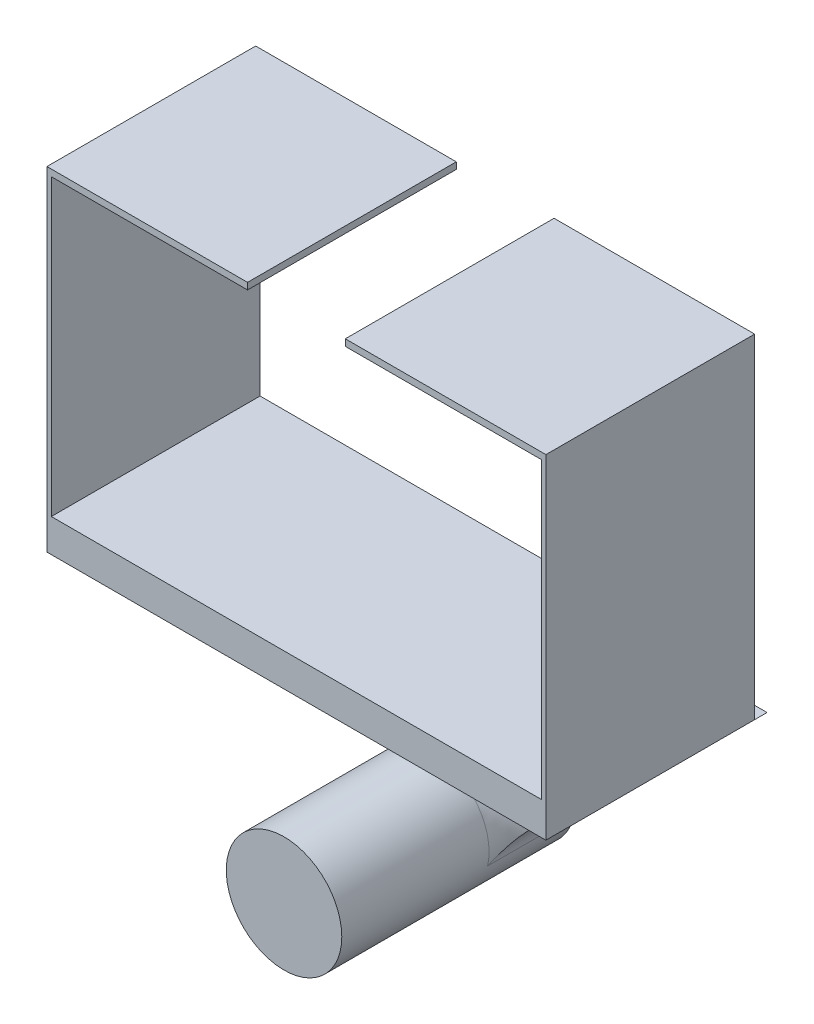
ISO-10303-21;
HEADER;
FILE_DESCRIPTION(('STEP AP214'),'2;1');
FILE_NAME('part.step','',(''),(''),'','','');
FILE_SCHEMA(('AUTOMOTIVE_DESIGN { 1 0 10303 214 1 1 1 1 }'));
ENDSEC;
DATA;
#1=APPLICATION_CONTEXT('core data for automotive mechanical design processes');
#2=APPLICATION_PROTOCOL_DEFINITION('international standard','automotive_design',2000,#1);
#3=PRODUCT_CONTEXT('',#1,'mechanical');
#4=PRODUCT('Part','Part','',(#3));
#5=PRODUCT_RELATED_PRODUCT_CATEGORY('part','',(#4));
#6=PRODUCT_DEFINITION_FORMATION('','',#4);
#7=PRODUCT_DEFINITION_CONTEXT('part definition',#1,'design');
#8=PRODUCT_DEFINITION('design','',#6,#7);
#9=PRODUCT_DEFINITION_SHAPE('','',#8);
#10=(LENGTH_UNIT() NAMED_UNIT(*) SI_UNIT(.MILLI.,.METRE.));
#11=(NAMED_UNIT(*) PLANE_ANGLE_UNIT() SI_UNIT($,.RADIAN.));
#12=(NAMED_UNIT(*) SI_UNIT($,.STERADIAN.) SOLID_ANGLE_UNIT());
#13=UNCERTAINTY_MEASURE_WITH_UNIT(LENGTH_MEASURE(1.E-05),#10,'distance_accuracy_value','');
#14=(GEOMETRIC_REPRESENTATION_CONTEXT(3) GLOBAL_UNCERTAINTY_ASSIGNED_CONTEXT((#13)) GLOBAL_UNIT_ASSIGNED_CONTEXT((#10,
#11,#12)) REPRESENTATION_CONTEXT('',''));
#15=CARTESIAN_POINT('',(0.,0.,0.));
#16=DIRECTION('',(0.,0.,1.));
#17=DIRECTION('',(1.,0.,0.));
#18=AXIS2_PLACEMENT_3D('',#15,#16,#17);
#19=CARTESIAN_POINT('',(0.,0.,-19.05));
#20=DIRECTION('',(0.,0.,-1.));
#21=DIRECTION('',(-1.,0.,0.));
#22=AXIS2_PLACEMENT_3D('',#19,#20,#21);
#23=TOROIDAL_SURFACE('',#22,13.8227494521249,6.35);
#24=CARTESIAN_POINT('',(9.20129048099303,1.56250833045129,-23.5405221598038));
#25=CARTESIAN_POINT('',(9.12447143228191,1.49305911225083,-23.4531719699937));
#26=CARTESIAN_POINT('',(9.05054991816206,1.42283327463212,-23.3639544715265));
#27=CARTESIAN_POINT('',(8.90822884561001,1.28114921356395,-23.1822346767722));
#28=CARTESIAN_POINT('',(8.83982696721798,1.20969152336378,-23.0897337843175));
#29=CARTESIAN_POINT('',(8.64267068130203,0.994160488198916,-22.8082561890728));
#30=CARTESIAN_POINT('',(8.5216500132169,0.848639110754902,-22.6149393392792));
#31=CARTESIAN_POINT('',(8.29879272158506,0.556354352007747,-22.2210033267864));
#32=CARTESIAN_POINT('',(8.19683414347178,0.409605617025795,-22.0204411232039));
#33=CARTESIAN_POINT('',(8.00901026563295,0.11458913340125,-21.6129257446468));
#34=CARTESIAN_POINT('',(7.92315049662919,-0.0336791188869155,-21.4059704016554));
#35=CARTESIAN_POINT('',(7.77940526535196,-0.305848442452853,-21.0235468802228));
#36=CARTESIAN_POINT('',(7.71924820723049,-0.429555849135334,-20.8487831684695));
#37=CARTESIAN_POINT('',(7.60805290356127,-0.677960128349764,-20.4969688543684));
#38=CARTESIAN_POINT('',(7.55701822807717,-0.802657368403367,-20.3199173856409));
#39=CARTESIAN_POINT('',(7.46320798115231,-1.05402686520723,-19.963210925047));
#40=CARTESIAN_POINT('',(7.42048917275977,-1.18070672635545,-19.7835464614004));
#41=CARTESIAN_POINT('',(7.34334027089114,-1.43552917861257,-19.4235315170715));
#42=CARTESIAN_POINT('',(7.30890823975931,-1.563671420426,-19.2431812067955));
#43=CARTESIAN_POINT('',(7.27779566223699,-1.69580344329123,-19.0585600924886));
#44=CARTESIAN_POINT('',(7.27707665782426,-1.69886717133372,-19.0542800411443));
#45=CARTESIAN_POINT('',(7.27635992810099,-1.70193142369473,-19.05));
#46=B_SPLINE_CURVE_WITH_KNOTS('',3,(#24,#25,#26,#27,#28,#29,#30,#31,#32,#33,#34,#35,#36,#37,#38,
#39,#40,#41,#42,#43,#44,#45),.UNSPECIFIED.,.F.,.F.,(4,2,2,2,2,2,2,2,2,2,4),(0.,
0.406322901873472,0.812474122719447,1.62309363120789,2.42833485674762,3.23385221685592,
3.90086742583033,4.56814310380479,5.23982503406811,5.91134975537807,5.92728713437383),.UNSPECIFIED.);
#47=CARTESIAN_POINT('',(9.20129048099302,1.56250833045129,-23.5405221598038));
#48=VERTEX_POINT('',#47);
#49=CARTESIAN_POINT('',(7.27635992810104,-1.70193142369486,-19.05));
#50=VERTEX_POINT('',#49);
#51=EDGE_CURVE('E12',#48,#50,#46,.T.);
#52=ORIENTED_EDGE('',*,*,#51,.F.);
#53=CARTESIAN_POINT('',(9.20129048099302,1.56250833045129,-23.5405221598038));
#54=CARTESIAN_POINT('',(9.3297867547812,1.67866206638977,-23.6865969379361));
#55=CARTESIAN_POINT('',(9.46295654800344,1.79904041309902,-23.8251740855197));
#56=CARTESIAN_POINT('',(9.73755444640503,2.04726217735639,-24.0865306476336));
#57=CARTESIAN_POINT('',(9.87898179766771,2.17510491340431,-24.2093115011));
#58=CARTESIAN_POINT('',(10.1648473935915,2.43351207155714,-24.4349978961655));
#59=CARTESIAN_POINT('',(10.3090811711777,2.56389166639872,-24.5383745208502));
#60=CARTESIAN_POINT('',(10.6033963628109,2.82993680563752,-24.7287278227252));
#61=CARTESIAN_POINT('',(10.7534780009589,2.9656025526101,-24.815703870667));
#62=CARTESIAN_POINT('',(11.0637392947505,3.24606211247563,-24.9751547000895));
#63=CARTESIAN_POINT('',(11.2240887503921,3.39100941545484,-25.0470305671752));
#64=CARTESIAN_POINT('',(11.5488380195187,3.68456532754717,-25.1715460652564));
#65=CARTESIAN_POINT('',(11.7132375429171,3.83317367443745,-25.2241870697007));
#66=CARTESIAN_POINT('',(12.0499611829547,4.13755377524608,-25.3107538897783));
#67=CARTESIAN_POINT('',(12.222373871997,4.2934055938636,-25.3440579042153));
#68=CARTESIAN_POINT('',(12.5688467131087,4.6065984492664,-25.3887018406444));
#69=CARTESIAN_POINT('',(12.7429077182123,4.76394025714885,-25.4000296861277));
#70=CARTESIAN_POINT('',(12.9170062761552,4.92131601078283,-25.4));
#71=B_SPLINE_CURVE_WITH_KNOTS('',3,(#53,#54,#55,#56,#57,#58,#59,#60,#61,#62,#63,#64,#65,#66,#67,
#68,#69,#70),.UNSPECIFIED.,.F.,.F.,(4,2,2,2,2,2,2,2,4),(0.,0.679521621999242,1.35898130026054,
2.01884528035295,2.67873457260078,3.36123209380029,4.04368087232189,4.74700715432743,
5.45071982409082),.UNSPECIFIED.);
#72=CARTESIAN_POINT('',(12.9170062761552,4.92131601078283,-25.4));
#73=VERTEX_POINT('',#72);
#74=EDGE_CURVE('E231',#73,#48,#71,.F.);
#75=ORIENTED_EDGE('',*,*,#74,.F.);
#76=CARTESIAN_POINT('',(0.,0.,-25.4));
#77=DIRECTION('',(0.,0.,-1.));
#78=DIRECTION('',(-1.,0.,0.));
#79=AXIS2_PLACEMENT_3D('',#76,#77,#78);
#80=CIRCLE('',#79,13.8227494521249);
#81=CARTESIAN_POINT('',(-12.9170062761552,4.92131601078283,-25.4));
#82=VERTEX_POINT('',#81);
#83=EDGE_CURVE('E239',#82,#73,#80,.T.);
#84=ORIENTED_EDGE('',*,*,#83,.F.);
#85=CARTESIAN_POINT('',(-9.20129048099302,1.56250833045129,-23.5405221598038));
#86=CARTESIAN_POINT('',(-9.3297867547812,1.67866206638977,-23.6865969379361));
#87=CARTESIAN_POINT('',(-9.46295654800344,1.79904041309902,-23.8251740855197));
#88=CARTESIAN_POINT('',(-9.73755444640503,2.04726217735639,-24.0865306476336));
#89=CARTESIAN_POINT('',(-9.8789817976677,2.17510491340431,-24.2093115011));
#90=CARTESIAN_POINT('',(-10.1648473935915,2.43351207155714,-24.4349978961655));
#91=CARTESIAN_POINT('',(-10.3090811711777,2.56389166639872,-24.5383745208502));
#92=CARTESIAN_POINT('',(-10.6033963628109,2.82993680563752,-24.7287278227252));
#93=CARTESIAN_POINT('',(-10.7534780009589,2.9656025526101,-24.815703870667));
#94=CARTESIAN_POINT('',(-11.0637392947505,3.24606211247563,-24.9751547000895));
#95=CARTESIAN_POINT('',(-11.2240887503921,3.39100941545484,-25.0470305671752));
#96=CARTESIAN_POINT('',(-11.5488380195187,3.68456532754717,-25.1715460652564));
#97=CARTESIAN_POINT('',(-11.7132375429171,3.83317367443745,-25.2241870697007));
#98=CARTESIAN_POINT('',(-12.0499611829547,4.13755377524608,-25.3107538897783));
#99=CARTESIAN_POINT('',(-12.222373871997,4.2934055938636,-25.3440579042153));
#100=CARTESIAN_POINT('',(-12.5688467131087,4.6065984492664,-25.3887018406444));
#101=CARTESIAN_POINT('',(-12.7429077182123,4.76394025714885,-25.4000296861277));
#102=CARTESIAN_POINT('',(-12.9170062761552,4.92131601078283,-25.4));
#103=B_SPLINE_CURVE_WITH_KNOTS('',3,(#85,#86,#87,#88,#89,#90,#91,#92,#93,#94,#95,#96,#97,#98,
#99,#100,#101,#102),.UNSPECIFIED.,.F.,.F.,(4,2,2,2,2,2,2,2,4),(0.,0.679521621999242,
1.35898130026054,2.01884528035295,2.67873457260078,3.3612320938003,4.04368087232189,
4.74700715432743,5.45071982409082),.UNSPECIFIED.);
#104=CARTESIAN_POINT('',(-9.201290480993,1.56250833045126,-23.5405221598039));
#105=VERTEX_POINT('',#104);
#106=EDGE_CURVE('E240',#105,#82,#103,.T.);
#107=ORIENTED_EDGE('',*,*,#106,.F.);
#108=CARTESIAN_POINT('',(-9.20129048099303,1.56250833045129,-23.5405221598038));
#109=CARTESIAN_POINT('',(-9.12447143228196,1.49305911225087,-23.4531719699938));
#110=CARTESIAN_POINT('',(-9.05054991816213,1.42283327463219,-23.3639544715266));
#111=CARTESIAN_POINT('',(-8.90822884561015,1.28114921356409,-23.1822346767724));
#112=CARTESIAN_POINT('',(-8.83982696721815,1.20969152336396,-23.0897337843178));
#113=CARTESIAN_POINT('',(-8.64267068130228,0.994160488199216,-22.8082561890732));
#114=CARTESIAN_POINT('',(-8.52165001321721,0.848639110755284,-22.6149393392797));
#115=CARTESIAN_POINT('',(-8.29879272158533,0.556354352008129,-22.2210033267869));
#116=CARTESIAN_POINT('',(-8.19683414347199,0.409605617026094,-22.0204411232044));
#117=CARTESIAN_POINT('',(-8.00901026563305,0.114589133401417,-21.612925744647));
#118=CARTESIAN_POINT('',(-7.92315049662924,-0.0336791188867981,-21.4059704016555));
#119=CARTESIAN_POINT('',(-7.77940526535195,-0.305848442452894,-21.0235468802228));
#120=CARTESIAN_POINT('',(-7.71924820723046,-0.42955584913546,-20.8487831684696));
#121=CARTESIAN_POINT('',(-7.60805290356129,-0.677960128349668,-20.4969688543683));
#122=CARTESIAN_POINT('',(-7.55701822807726,-0.802657368402962,-20.3199173856406));
#123=CARTESIAN_POINT('',(-7.46320798115222,-1.05402686520765,-19.9632109250473));
#124=CARTESIAN_POINT('',(-7.42048917275941,-1.180706726357,-19.7835464614015));
#125=CARTESIAN_POINT('',(-7.3433402708915,-1.435529178611,-19.4235315170703));
#126=CARTESIAN_POINT('',(-7.30890823976066,-1.56367142042017,-19.2431812067911));
#127=CARTESIAN_POINT('',(-7.27779566223706,-1.69580344329096,-19.0585600924884));
#128=CARTESIAN_POINT('',(-7.27707665782429,-1.69886717133358,-19.0542800411442));
#129=CARTESIAN_POINT('',(-7.27635992810099,-1.70193142369473,-19.05));
#130=B_SPLINE_CURVE_WITH_KNOTS('',3,(#108,#109,#110,#111,#112,#113,#114,#115,#116,#117,#118,
#119,#120,#121,#122,#123,#124,#125,#126,#127,#128,#129),.UNSPECIFIED.,.F.,.F.,(4,2,2,2,2,2,2,2,
2,2,4),(0.,0.406322901873264,0.812474122719031,1.62309363120705,2.42833485674719,
3.23385221685592,3.90086742583037,4.56814310380479,5.2398250340681,5.91134975537807,
5.92728713437383),.UNSPECIFIED.);
#131=CARTESIAN_POINT('',(-7.27635992810104,-1.70193142369486,-19.05));
#132=VERTEX_POINT('',#131);
#133=EDGE_CURVE('E82',#105,#132,#130,.T.);
#134=ORIENTED_EDGE('',*,*,#133,.T.);
#135=CARTESIAN_POINT('',(0.,0.,-19.05));
#136=DIRECTION('',(0.,0.,-1.));
#137=DIRECTION('',(-1.,0.,0.));
#138=AXIS2_PLACEMENT_3D('',#135,#136,#137);
#139=CIRCLE('',#138,7.47274945212493);
#140=EDGE_CURVE('E474',#50,#132,#139,.F.);
#141=ORIENTED_EDGE('',*,*,#140,.F.);
#142=EDGE_LOOP('',(#52,#75,#84,#107,#134,#141));
#143=FACE_BOUND('',#142,.T.);
#144=ADVANCED_FACE('F69',(#143),#23,.F.);
#145=CARTESIAN_POINT('',(-13.4594771113357,-3.14815474614112,-25.4));
#146=DIRECTION('',(0.,0.,1.));
#147=DIRECTION('',(1.,0.,0.));
#148=AXIS2_PLACEMENT_3D('',#145,#146,#147);
#149=CYLINDRICAL_SURFACE('',#148,6.35);
#150=ORIENTED_EDGE('',*,*,#133,.F.);
#151=DIRECTION('',(0.,0.,-1.));
#152=VECTOR('',#151,1.);
#153=CARTESIAN_POINT('',(-9.20129048099299,1.56250833045127,-25.4));
#154=LINE('',#153,#152);
#155=CARTESIAN_POINT('',(-9.201290480993,1.56250833045127,-30.2126316201082));
#156=VERTEX_POINT('',#155);
#157=EDGE_CURVE('E470',#156,#105,#154,.F.);
#158=ORIENTED_EDGE('',*,*,#157,.F.);
#159=CARTESIAN_POINT('',(-13.4594771113357,-3.14815474614112,-30.2126316201082));
#160=DIRECTION('',(0.,0.,1.));
#161=DIRECTION('',(-1.,0.,0.));
#162=AXIS2_PLACEMENT_3D('',#159,#160,#161);
#163=CIRCLE('',#162,6.35);
#164=CARTESIAN_POINT('',(-7.27635992810065,-1.70193142369615,-30.2126316201082));
#165=VERTEX_POINT('',#164);
#166=EDGE_CURVE('E263',#165,#156,#163,.T.);
#167=ORIENTED_EDGE('',*,*,#166,.F.);
#168=DIRECTION('',(0.,0.,1.));
#169=VECTOR('',#168,1.);
#170=CARTESIAN_POINT('',(-7.27635992810099,-1.70193142369473,-25.4));
#171=LINE('',#170,#169);
#172=EDGE_CURVE('E480',#132,#165,#171,.F.);
#173=ORIENTED_EDGE('',*,*,#172,.F.);
#174=EDGE_LOOP('',(#150,#158,#167,#173));
#175=FACE_BOUND('',#174,.T.);
#176=ADVANCED_FACE('F580',(#175),#149,.F.);
#177=CARTESIAN_POINT('',(13.4594771113357,-3.14815474614112,-25.4));
#178=DIRECTION('',(0.,0.,1.));
#179=DIRECTION('',(1.,0.,0.));
#180=AXIS2_PLACEMENT_3D('',#177,#178,#179);
#181=CYLINDRICAL_SURFACE('',#180,6.35);
#182=DIRECTION('',(0.,0.,1.));
#183=VECTOR('',#182,1.);
#184=CARTESIAN_POINT('',(9.20129048099299,1.56250833045127,-25.4));
#185=LINE('',#184,#183);
#186=CARTESIAN_POINT('',(9.201290480993,1.56250833045127,-30.2126316201082));
#187=VERTEX_POINT('',#186);
#188=EDGE_CURVE('E226',#48,#187,#185,.F.);
#189=ORIENTED_EDGE('',*,*,#188,.F.);
#190=ORIENTED_EDGE('',*,*,#51,.T.);
#191=DIRECTION('',(0.,0.,1.));
#192=VECTOR('',#191,1.);
#193=CARTESIAN_POINT('',(7.27635992810099,-1.70193142369473,-25.4));
#194=LINE('',#193,#192);
#195=CARTESIAN_POINT('',(7.27635992810097,-1.70193142369478,-30.2126316201082));
#196=VERTEX_POINT('',#195);
#197=EDGE_CURVE('E245',#196,#50,#194,.T.);
#198=ORIENTED_EDGE('',*,*,#197,.F.);
#199=CARTESIAN_POINT('',(13.4594771113357,-3.14815474614112,-30.2126316201082));
#200=DIRECTION('',(0.,0.,1.));
#201=DIRECTION('',(-1.,0.,0.));
#202=AXIS2_PLACEMENT_3D('',#199,#200,#201);
#203=CIRCLE('',#202,6.35);
#204=EDGE_CURVE('E244',#187,#196,#203,.T.);
#205=ORIENTED_EDGE('',*,*,#204,.F.);
#206=EDGE_LOOP('',(#189,#190,#198,#205));
#207=FACE_BOUND('',#206,.T.);
#208=ADVANCED_FACE('F70',(#207),#181,.F.);
#209=CARTESIAN_POINT('',(31.70428,16.0682483563748,-19.05));
#210=DIRECTION('',(1.,0.,0.));
#211=DIRECTION('',(0.,1.,0.));
#212=AXIS2_PLACEMENT_3D('',#209,#210,#211);
#213=CYLINDRICAL_SURFACE('',#212,6.35);
#214=DIRECTION('',(1.,0.,0.));
#215=VECTOR('',#214,1.);
#216=CARTESIAN_POINT('',(31.70428,22.4182483563748,-19.05));
#217=LINE('',#216,#215);
#218=CARTESIAN_POINT('',(-32.2731689597485,22.4182483563748,-19.05));
#219=VERTEX_POINT('',#218);
#220=CARTESIAN_POINT('',(32.2731689597485,22.4182483563748,-19.05));
#221=VERTEX_POINT('',#220);
#222=EDGE_CURVE('E452',#219,#221,#217,.T.);
#223=ORIENTED_EDGE('',*,*,#222,.F.);
#224=CARTESIAN_POINT('',(-25.2484156708222,16.0682483563748,-19.05));
#225=DIRECTION('',(-0.67058057170751,-0.741836704975178,0.));
#226=DIRECTION('',(0.741836704975178,-0.67058057170751,0.));
#227=AXIS2_PLACEMENT_3D('',#224,#225,#226);
#228=ELLIPSE('',#227,9.46940646346329,6.35);
#229=CARTESIAN_POINT('',(-25.2484156708222,16.0682483563748,-25.4));
#230=VERTEX_POINT('',#229);
#231=EDGE_CURVE('E458',#219,#230,#228,.T.);
#232=ORIENTED_EDGE('',*,*,#231,.T.);
#233=DIRECTION('',(1.,0.,0.));
#234=VECTOR('',#233,1.);
#235=CARTESIAN_POINT('',(0.,16.0682483563748,-25.4));
#236=LINE('',#235,#234);
#237=CARTESIAN_POINT('',(25.2484156708222,16.0682483563748,-25.4));
#238=VERTEX_POINT('',#237);
#239=EDGE_CURVE('E457',#238,#230,#236,.F.);
#240=ORIENTED_EDGE('',*,*,#239,.F.);
#241=CARTESIAN_POINT('',(25.2484156708222,16.0682483563748,-19.05));
#242=DIRECTION('',(-0.67058057170751,0.741836704975178,0.));
#243=DIRECTION('',(0.741836704975178,0.67058057170751,0.));
#244=AXIS2_PLACEMENT_3D('',#241,#242,#243);
#245=ELLIPSE('',#244,9.46940646346329,6.35);
#246=EDGE_CURVE('E461',#238,#221,#245,.F.);
#247=ORIENTED_EDGE('',*,*,#246,.T.);
#248=EDGE_LOOP('',(#223,#232,#240,#247));
#249=FACE_BOUND('',#248,.T.);
#250=ADVANCED_FACE('F522',(#249),#213,.F.);
#251=CARTESIAN_POINT('',(-31.70428,64.7626659164591,-28.6084210800721));
#252=DIRECTION('',(1.,0.,0.));
#253=DIRECTION('',(0.,0.,-1.));
#254=AXIS2_PLACEMENT_3D('',#251,#252,#253);
#255=PLANE('',#254);
#256=DIRECTION('',(0.,-1.,0.));
#257=VECTOR('',#256,1.);
#258=CARTESIAN_POINT('',(-31.70428,64.7626659164591,-28.6084210800721));
#259=LINE('',#258,#257);
#260=CARTESIAN_POINT('',(-31.70428,64.7626659164591,-28.6084210800721));
#261=VERTEX_POINT('',#260);
#262=CARTESIAN_POINT('',(-31.70428,26.6880659164591,-28.6084210800721));
#263=VERTEX_POINT('',#262);
#264=EDGE_CURVE('E361',#261,#263,#259,.T.);
#265=ORIENTED_EDGE('',*,*,#264,.F.);
#266=DIRECTION('',(0.,0.,1.));
#267=VECTOR('',#266,1.);
#268=CARTESIAN_POINT('',(-31.70428,64.7626659164591,-28.6084210800721));
#269=LINE('',#268,#267);
#270=CARTESIAN_POINT('',(-31.70428,64.7626659164591,-1.60421054003606));
#271=VERTEX_POINT('',#270);
#272=EDGE_CURVE('E313',#261,#271,#269,.T.);
#273=ORIENTED_EDGE('',*,*,#272,.T.);
#274=DIRECTION('',(0.,-1.,0.));
#275=VECTOR('',#274,1.);
#276=CARTESIAN_POINT('',(-31.70428,64.7626659164591,-1.60421054003606));
#277=LINE('',#276,#275);
#278=CARTESIAN_POINT('',(-31.70428,26.6880659164591,-1.60421054003606));
#279=VERTEX_POINT('',#278);
#280=EDGE_CURVE('E362',#271,#279,#277,.T.);
#281=ORIENTED_EDGE('',*,*,#280,.T.);
#282=DIRECTION('',(0.,0.,1.));
#283=VECTOR('',#282,1.);
#284=CARTESIAN_POINT('',(-31.70428,26.6880659164591,-28.6084210800721));
#285=LINE('',#284,#283);
#286=EDGE_CURVE('E360',#263,#279,#285,.T.);
#287=ORIENTED_EDGE('',*,*,#286,.F.);
#288=EDGE_LOOP('',(#265,#273,#281,#287));
#289=FACE_BOUND('',#288,.T.);
#290=ADVANCED_FACE('F516',(#289),#255,.T.);
#291=CARTESIAN_POINT('',(31.70428,64.7626659164591,-28.6084210800721));
#292=DIRECTION('',(1.,0.,0.));
#293=DIRECTION('',(0.,0.,-1.));
#294=AXIS2_PLACEMENT_3D('',#291,#292,#293);
#295=PLANE('',#294);
#296=DIRECTION('',(0.,0.,1.));
#297=VECTOR('',#296,1.);
#298=CARTESIAN_POINT('',(31.70428,64.7626659164591,-28.6084210800721));
#299=LINE('',#298,#297);
#300=CARTESIAN_POINT('',(31.70428,64.7626659164591,-28.6084210800721));
#301=VERTEX_POINT('',#300);
#302=CARTESIAN_POINT('',(31.70428,64.7626659164591,-1.60421054003606));
#303=VERTEX_POINT('',#302);
#304=EDGE_CURVE('E379',#301,#303,#299,.T.);
#305=ORIENTED_EDGE('',*,*,#304,.F.);
#306=DIRECTION('',(0.,-1.,0.));
#307=VECTOR('',#306,1.);
#308=CARTESIAN_POINT('',(31.70428,64.7626659164591,-28.6084210800721));
#309=LINE('',#308,#307);
#310=CARTESIAN_POINT('',(31.70428,26.6880659164591,-28.6084210800721));
#311=VERTEX_POINT('',#310);
#312=EDGE_CURVE('E419',#301,#311,#309,.T.);
#313=ORIENTED_EDGE('',*,*,#312,.T.);
#314=DIRECTION('',(0.,0.,1.));
#315=VECTOR('',#314,1.);
#316=CARTESIAN_POINT('',(31.70428,26.6880659164591,-28.6084210800721));
#317=LINE('',#316,#315);
#318=CARTESIAN_POINT('',(31.70428,26.6880659164591,-1.60421054003606));
#319=VERTEX_POINT('',#318);
#320=EDGE_CURVE('E416',#311,#319,#317,.T.);
#321=ORIENTED_EDGE('',*,*,#320,.T.);
#322=DIRECTION('',(0.,-1.,0.));
#323=VECTOR('',#322,1.);
#324=CARTESIAN_POINT('',(31.70428,64.7626659164591,-1.60421054003606));
#325=LINE('',#324,#323);
#326=EDGE_CURVE('E423',#303,#319,#325,.T.);
#327=ORIENTED_EDGE('',*,*,#326,.F.);
#328=EDGE_LOOP('',(#305,#313,#321,#327));
#329=FACE_BOUND('',#328,.T.);
#330=ADVANCED_FACE('F517',(#329),#295,.F.);
#331=CARTESIAN_POINT('',(31.70428,26.6880659164591,-1.60421054003606));
#332=DIRECTION('',(0.,-1.,0.));
#333=DIRECTION('',(0.,0.,-1.));
#334=AXIS2_PLACEMENT_3D('',#331,#332,#333);
#335=PLANE('',#334);
#336=DIRECTION('',(-1.,0.,0.));
#337=VECTOR('',#336,1.);
#338=CARTESIAN_POINT('',(31.70428,26.6880659164591,-28.6084210800721));
#339=LINE('',#338,#337);
#340=EDGE_CURVE('E440',#311,#263,#339,.T.);
#341=ORIENTED_EDGE('',*,*,#340,.T.);
#342=ORIENTED_EDGE('',*,*,#286,.T.);
#343=DIRECTION('',(-1.,0.,0.));
#344=VECTOR('',#343,1.);
#345=CARTESIAN_POINT('',(31.70428,26.6880659164591,-1.60421054003606));
#346=LINE('',#345,#344);
#347=EDGE_CURVE('E444',#319,#279,#346,.T.);
#348=ORIENTED_EDGE('',*,*,#347,.F.);
#349=ORIENTED_EDGE('',*,*,#320,.F.);
#350=EDGE_LOOP('',(#341,#342,#348,#349));
#351=FACE_BOUND('',#350,.T.);
#352=ADVANCED_FACE('F544',(#351),#335,.F.);
#353=CARTESIAN_POINT('',(0.,0.,-25.4));
#354=DIRECTION('',(0.,0.,1.));
#355=DIRECTION('',(1.,0.,0.));
#356=AXIS2_PLACEMENT_3D('',#353,#354,#355);
#357=CYLINDRICAL_SURFACE('',#356,7.47274945212493);
#358=ORIENTED_EDGE('',*,*,#140,.T.);
#359=ORIENTED_EDGE('',*,*,#172,.T.);
#360=CARTESIAN_POINT('',(0.,0.,-30.2126316201082));
#361=DIRECTION('',(0.,0.,-1.));
#362=DIRECTION('',(-1.,0.,0.));
#363=AXIS2_PLACEMENT_3D('',#360,#361,#362);
#364=CIRCLE('',#363,7.47274945212492);
#365=EDGE_CURVE('E249',#196,#165,#364,.T.);
#366=ORIENTED_EDGE('',*,*,#365,.F.);
#367=ORIENTED_EDGE('',*,*,#197,.T.);
#368=EDGE_LOOP('',(#358,#359,#366,#367));
#369=FACE_BOUND('',#368,.T.);
#370=CARTESIAN_POINT('',(0.,0.,0.));
#371=DIRECTION('',(0.,0.,1.));
#372=DIRECTION('',(1.,0.,0.));
#373=AXIS2_PLACEMENT_3D('',#370,#371,#372);
#374=CIRCLE('',#373,7.47274945212493);
#375=CARTESIAN_POINT('',(7.47274945212493,0.,0.));
#376=VERTEX_POINT('',#375);
#377=EDGE_CURVE('E442',#376,#376,#374,.T.);
#378=ORIENTED_EDGE('',*,*,#377,.F.);
#379=EDGE_LOOP('',(#378));
#380=FACE_BOUND('',#379,.T.);
#381=ADVANCED_FACE('F554',(#369,#380),#357,.T.);
#382=CARTESIAN_POINT('',(0.,0.,0.));
#383=DIRECTION('',(0.,0.,1.));
#384=DIRECTION('',(1.,0.,0.));
#385=AXIS2_PLACEMENT_3D('',#382,#383,#384);
#386=PLANE('',#385);
#387=ORIENTED_EDGE('',*,*,#377,.T.);
#388=EDGE_LOOP('',(#387));
#389=FACE_BOUND('',#388,.T.);
#390=ADVANCED_FACE('F564',(#389),#386,.T.);
#391=CARTESIAN_POINT('',(0.,0.,-25.4));
#392=DIRECTION('',(0.,0.,-1.));
#393=DIRECTION('',(-1.,0.,0.));
#394=AXIS2_PLACEMENT_3D('',#391,#392,#393);
#395=PLANE('',#394);
#396=DIRECTION('',(-0.741836704975178,0.67058057170751,0.));
#397=VECTOR('',#396,1.);
#398=CARTESIAN_POINT('',(-3.36033329350836,-3.71740352054509,-25.4));
#399=LINE('',#398,#397);
#400=EDGE_CURVE('E310',#82,#230,#399,.T.);
#401=ORIENTED_EDGE('',*,*,#400,.F.);
#402=ORIENTED_EDGE('',*,*,#83,.T.);
#403=DIRECTION('',(0.741836704975178,0.67058057170751,0.));
#404=VECTOR('',#403,1.);
#405=CARTESIAN_POINT('',(3.36033329350836,-3.71740352054509,-25.4));
#406=LINE('',#405,#404);
#407=EDGE_CURVE('E306',#73,#238,#406,.T.);
#408=ORIENTED_EDGE('',*,*,#407,.T.);
#409=ORIENTED_EDGE('',*,*,#239,.T.);
#410=EDGE_LOOP('',(#401,#402,#408,#409));
#411=FACE_BOUND('',#410,.T.);
#412=ADVANCED_FACE('F563',(#411),#395,.F.);
#413=CARTESIAN_POINT('',(0.,0.,-28.6084210800721));
#414=DIRECTION('',(0.,0.,-1.));
#415=DIRECTION('',(-1.,0.,0.));
#416=AXIS2_PLACEMENT_3D('',#413,#414,#415);
#417=PLANE('',#416);
#418=DIRECTION('',(1.,0.,0.));
#419=VECTOR('',#418,1.);
#420=CARTESIAN_POINT('',(32.2731689597485,22.4182483563748,-28.6084210800721));
#421=LINE('',#420,#419);
#422=CARTESIAN_POINT('',(25.9231689597485,22.4182483563748,-28.6084210800721));
#423=VERTEX_POINT('',#422);
#424=CARTESIAN_POINT('',(32.2731689597485,22.4182483563748,-28.6084210800721));
#425=VERTEX_POINT('',#424);
#426=EDGE_CURVE('E89',#423,#425,#421,.T.);
#427=ORIENTED_EDGE('',*,*,#426,.F.);
#428=DIRECTION('',(0.756389008580475,0.654122058715838,0.));
#429=VECTOR('',#428,1.);
#430=CARTESIAN_POINT('',(25.9231689597485,22.4182483563748,-28.6084210800721));
#431=LINE('',#430,#429);
#432=CARTESIAN_POINT('',(0.,0.,-28.6084210800721));
#433=VERTEX_POINT('',#432);
#434=EDGE_CURVE('E91',#433,#423,#431,.T.);
#435=ORIENTED_EDGE('',*,*,#434,.F.);
#436=DIRECTION('',(0.756389008580475,-0.654122058715838,0.));
#437=VECTOR('',#436,1.);
#438=CARTESIAN_POINT('',(0.,0.,-28.6084210800721));
#439=LINE('',#438,#437);
#440=CARTESIAN_POINT('',(-25.9231689597485,22.4182483563748,-28.6084210800721));
#441=VERTEX_POINT('',#440);
#442=EDGE_CURVE('E281',#441,#433,#439,.T.);
#443=ORIENTED_EDGE('',*,*,#442,.F.);
#444=DIRECTION('',(1.,0.,0.));
#445=VECTOR('',#444,1.);
#446=CARTESIAN_POINT('',(-25.9231689597485,22.4182483563748,-28.6084210800721));
#447=LINE('',#446,#445);
#448=CARTESIAN_POINT('',(-32.2731689597485,22.4182483563748,-28.6084210800721));
#449=VERTEX_POINT('',#448);
#450=EDGE_CURVE('E279',#449,#441,#447,.T.);
#451=ORIENTED_EDGE('',*,*,#450,.F.);
#452=DIRECTION('',(0.,1.,0.));
#453=VECTOR('',#452,1.);
#454=CARTESIAN_POINT('',(-32.2731689597485,26.6880659164591,-28.6084210800721));
#455=LINE('',#454,#453);
#456=CARTESIAN_POINT('',(-32.2731689597485,65.6161132249689,-28.6084210800721));
#457=VERTEX_POINT('',#456);
#458=EDGE_CURVE('E372',#449,#457,#455,.T.);
#459=ORIENTED_EDGE('',*,*,#458,.T.);
#460=DIRECTION('',(1.,0.,0.));
#461=VECTOR('',#460,1.);
#462=CARTESIAN_POINT('',(-31.70428,65.6161132249689,-28.6084210800721));
#463=LINE('',#462,#461);
#464=CARTESIAN_POINT('',(-6.3246,65.6161132249689,-28.6084210800721));
#465=VERTEX_POINT('',#464);
#466=EDGE_CURVE('E346',#457,#465,#463,.T.);
#467=ORIENTED_EDGE('',*,*,#466,.T.);
#468=DIRECTION('',(0.,-1.,0.));
#469=VECTOR('',#468,1.);
#470=CARTESIAN_POINT('',(-6.3246,65.6161132249689,-28.6084210800721));
#471=LINE('',#470,#469);
#472=CARTESIAN_POINT('',(-6.3246,64.7626659164591,-28.6084210800721));
#473=VERTEX_POINT('',#472);
#474=EDGE_CURVE('E322',#465,#473,#471,.T.);
#475=ORIENTED_EDGE('',*,*,#474,.T.);
#476=DIRECTION('',(-1.,0.,0.));
#477=VECTOR('',#476,1.);
#478=CARTESIAN_POINT('',(-6.3246,64.7626659164591,-28.6084210800721));
#479=LINE('',#478,#477);
#480=EDGE_CURVE('E340',#473,#261,#479,.T.);
#481=ORIENTED_EDGE('',*,*,#480,.T.);
#482=ORIENTED_EDGE('',*,*,#264,.T.);
#483=ORIENTED_EDGE('',*,*,#340,.F.);
#484=ORIENTED_EDGE('',*,*,#312,.F.);
#485=DIRECTION('',(1.,0.,0.));
#486=VECTOR('',#485,1.);
#487=CARTESIAN_POINT('',(6.3246,64.7626659164591,-28.6084210800721));
#488=LINE('',#487,#486);
#489=CARTESIAN_POINT('',(6.3246,64.7626659164591,-28.6084210800721));
#490=VERTEX_POINT('',#489);
#491=EDGE_CURVE('E402',#490,#301,#488,.T.);
#492=ORIENTED_EDGE('',*,*,#491,.F.);
#493=DIRECTION('',(0.,-1.,0.));
#494=VECTOR('',#493,1.);
#495=CARTESIAN_POINT('',(6.3246,65.6161132249689,-28.6084210800721));
#496=LINE('',#495,#494);
#497=CARTESIAN_POINT('',(6.3246,65.6161132249689,-28.6084210800721));
#498=VERTEX_POINT('',#497);
#499=EDGE_CURVE('E378',#498,#490,#496,.T.);
#500=ORIENTED_EDGE('',*,*,#499,.F.);
#501=DIRECTION('',(-1.,0.,0.));
#502=VECTOR('',#501,1.);
#503=CARTESIAN_POINT('',(31.70428,65.6161132249689,-28.6084210800721));
#504=LINE('',#503,#502);
#505=CARTESIAN_POINT('',(32.2731689597485,65.6161132249689,-28.6084210800721));
#506=VERTEX_POINT('',#505);
#507=EDGE_CURVE('E411',#506,#498,#504,.T.);
#508=ORIENTED_EDGE('',*,*,#507,.F.);
#509=DIRECTION('',(0.,1.,0.));
#510=VECTOR('',#509,1.);
#511=CARTESIAN_POINT('',(32.2731689597485,26.6880659164591,-28.6084210800721));
#512=LINE('',#511,#510);
#513=EDGE_CURVE('E431',#425,#506,#512,.T.);
#514=ORIENTED_EDGE('',*,*,#513,.F.);
#515=EDGE_LOOP('',(#427,#435,#443,#451,#459,#467,#475,#481,#482,#483,#484,#492,#500,#508,#514));
#516=FACE_BOUND('',#515,.T.);
#517=ADVANCED_FACE('F557',(#516),#417,.T.);
#518=CARTESIAN_POINT('',(31.70428,22.4182483563748,-1.60421054003606));
#519=DIRECTION('',(0.,-1.,0.));
#520=DIRECTION('',(1.,0.,0.));
#521=AXIS2_PLACEMENT_3D('',#518,#519,#520);
#522=PLANE('',#521);
#523=DIRECTION('',(0.,0.,-1.));
#524=VECTOR('',#523,1.);
#525=CARTESIAN_POINT('',(-32.2731689597485,22.4182483563748,-1.60421054003606));
#526=LINE('',#525,#524);
#527=CARTESIAN_POINT('',(-32.2731689597485,22.4182483563748,-1.60421054003606));
#528=VERTEX_POINT('',#527);
#529=EDGE_CURVE('E371',#528,#219,#526,.T.);
#530=ORIENTED_EDGE('',*,*,#529,.T.);
#531=ORIENTED_EDGE('',*,*,#222,.T.);
#532=DIRECTION('',(0.,0.,-1.));
#533=VECTOR('',#532,1.);
#534=CARTESIAN_POINT('',(32.2731689597485,22.4182483563748,-1.60421054003606));
#535=LINE('',#534,#533);
#536=CARTESIAN_POINT('',(32.2731689597485,22.4182483563748,-1.60421054003606));
#537=VERTEX_POINT('',#536);
#538=EDGE_CURVE('E429',#537,#221,#535,.T.);
#539=ORIENTED_EDGE('',*,*,#538,.F.);
#540=DIRECTION('',(-1.,0.,0.));
#541=VECTOR('',#540,1.);
#542=CARTESIAN_POINT('',(31.70428,22.4182483563748,-1.60421054003606));
#543=LINE('',#542,#541);
#544=EDGE_CURVE('E439',#537,#528,#543,.T.);
#545=ORIENTED_EDGE('',*,*,#544,.T.);
#546=EDGE_LOOP('',(#530,#531,#539,#545));
#547=FACE_BOUND('',#546,.T.);
#548=ADVANCED_FACE('F546',(#547),#522,.T.);
#549=CARTESIAN_POINT('',(0.,0.,-1.60421054003606));
#550=DIRECTION('',(0.,0.,-1.));
#551=DIRECTION('',(-1.,0.,0.));
#552=AXIS2_PLACEMENT_3D('',#549,#550,#551);
#553=PLANE('',#552);
#554=ORIENTED_EDGE('',*,*,#544,.F.);
#555=DIRECTION('',(0.,-1.,0.));
#556=VECTOR('',#555,1.);
#557=CARTESIAN_POINT('',(32.2731689597485,26.6880659164591,-1.60421054003606));
#558=LINE('',#557,#556);
#559=CARTESIAN_POINT('',(32.2731689597485,65.6161132249689,-1.60421054003606));
#560=VERTEX_POINT('',#559);
#561=EDGE_CURVE('E426',#560,#537,#558,.T.);
#562=ORIENTED_EDGE('',*,*,#561,.F.);
#563=DIRECTION('',(1.,0.,0.));
#564=VECTOR('',#563,1.);
#565=CARTESIAN_POINT('',(31.70428,65.6161132249689,-1.60421054003606));
#566=LINE('',#565,#564);
#567=CARTESIAN_POINT('',(6.3246,65.6161132249689,-1.60421054003606));
#568=VERTEX_POINT('',#567);
#569=EDGE_CURVE('E403',#568,#560,#566,.T.);
#570=ORIENTED_EDGE('',*,*,#569,.F.);
#571=DIRECTION('',(0.,1.,0.));
#572=VECTOR('',#571,1.);
#573=CARTESIAN_POINT('',(6.3246,65.6161132249689,-1.60421054003606));
#574=LINE('',#573,#572);
#575=CARTESIAN_POINT('',(6.3246,64.7626659164591,-1.60421054003606));
#576=VERTEX_POINT('',#575);
#577=EDGE_CURVE('E387',#576,#568,#574,.T.);
#578=ORIENTED_EDGE('',*,*,#577,.F.);
#579=DIRECTION('',(1.,0.,0.));
#580=VECTOR('',#579,1.);
#581=CARTESIAN_POINT('',(6.3246,64.7626659164591,-1.60421054003606));
#582=LINE('',#581,#580);
#583=EDGE_CURVE('E393',#576,#303,#582,.T.);
#584=ORIENTED_EDGE('',*,*,#583,.T.);
#585=ORIENTED_EDGE('',*,*,#326,.T.);
#586=ORIENTED_EDGE('',*,*,#347,.T.);
#587=ORIENTED_EDGE('',*,*,#280,.F.);
#588=DIRECTION('',(-1.,0.,0.));
#589=VECTOR('',#588,1.);
#590=CARTESIAN_POINT('',(-6.3246,64.7626659164591,-1.60421054003606));
#591=LINE('',#590,#589);
#592=CARTESIAN_POINT('',(-6.3246,64.7626659164591,-1.60421054003606));
#593=VERTEX_POINT('',#592);
#594=EDGE_CURVE('E343',#593,#271,#591,.T.);
#595=ORIENTED_EDGE('',*,*,#594,.F.);
#596=DIRECTION('',(0.,1.,0.));
#597=VECTOR('',#596,1.);
#598=CARTESIAN_POINT('',(-6.3246,65.6161132249689,-1.60421054003606));
#599=LINE('',#598,#597);
#600=CARTESIAN_POINT('',(-6.3246,65.6161132249689,-1.60421054003606));
#601=VERTEX_POINT('',#600);
#602=EDGE_CURVE('E326',#593,#601,#599,.T.);
#603=ORIENTED_EDGE('',*,*,#602,.T.);
#604=DIRECTION('',(-1.,0.,0.));
#605=VECTOR('',#604,1.);
#606=CARTESIAN_POINT('',(-31.70428,65.6161132249689,-1.60421054003606));
#607=LINE('',#606,#605);
#608=CARTESIAN_POINT('',(-32.2731689597485,65.6161132249689,-1.60421054003606));
#609=VERTEX_POINT('',#608);
#610=EDGE_CURVE('E352',#601,#609,#607,.T.);
#611=ORIENTED_EDGE('',*,*,#610,.T.);
#612=DIRECTION('',(0.,-1.,0.));
#613=VECTOR('',#612,1.);
#614=CARTESIAN_POINT('',(-32.2731689597485,26.6880659164591,-1.60421054003606));
#615=LINE('',#614,#613);
#616=EDGE_CURVE('E366',#609,#528,#615,.T.);
#617=ORIENTED_EDGE('',*,*,#616,.T.);
#618=EDGE_LOOP('',(#554,#562,#570,#578,#584,#585,#586,#587,#595,#603,#611,#617));
#619=FACE_BOUND('',#618,.T.);
#620=ADVANCED_FACE('F542',(#619),#553,.F.);
#621=CARTESIAN_POINT('',(32.2731689597485,0.,0.));
#622=DIRECTION('',(1.,0.,0.));
#623=DIRECTION('',(0.,0.,-1.));
#624=AXIS2_PLACEMENT_3D('',#621,#622,#623);
#625=PLANE('',#624);
#626=ORIENTED_EDGE('',*,*,#561,.T.);
#627=ORIENTED_EDGE('',*,*,#538,.T.);
#628=DIRECTION('',(0.,0.,-1.));
#629=VECTOR('',#628,1.);
#630=CARTESIAN_POINT('',(32.2731689597485,22.4182483563748,-25.4));
#631=LINE('',#630,#629);
#632=EDGE_CURVE('E312',#221,#425,#631,.T.);
#633=ORIENTED_EDGE('',*,*,#632,.T.);
#634=ORIENTED_EDGE('',*,*,#513,.T.);
#635=DIRECTION('',(0.,0.,-1.));
#636=VECTOR('',#635,1.);
#637=CARTESIAN_POINT('',(32.2731689597485,65.6161132249689,-28.6084210800721));
#638=LINE('',#637,#636);
#639=EDGE_CURVE('E410',#560,#506,#638,.T.);
#640=ORIENTED_EDGE('',*,*,#639,.F.);
#641=EDGE_LOOP('',(#626,#627,#633,#634,#640));
#642=FACE_BOUND('',#641,.T.);
#643=ADVANCED_FACE('F540',(#642),#625,.T.);
#644=CARTESIAN_POINT('',(0.,65.6161132249689,0.));
#645=DIRECTION('',(0.,1.,0.));
#646=DIRECTION('',(0.,0.,1.));
#647=AXIS2_PLACEMENT_3D('',#644,#645,#646);
#648=PLANE('',#647);
#649=ORIENTED_EDGE('',*,*,#507,.T.);
#650=DIRECTION('',(0.,0.,-1.));
#651=VECTOR('',#650,1.);
#652=CARTESIAN_POINT('',(6.3246,65.6161132249689,-28.6084210800721));
#653=LINE('',#652,#651);
#654=EDGE_CURVE('E388',#568,#498,#653,.T.);
#655=ORIENTED_EDGE('',*,*,#654,.F.);
#656=ORIENTED_EDGE('',*,*,#569,.T.);
#657=ORIENTED_EDGE('',*,*,#639,.T.);
#658=EDGE_LOOP('',(#649,#655,#656,#657));
#659=FACE_BOUND('',#658,.T.);
#660=ADVANCED_FACE('F531',(#659),#648,.T.);
#661=CARTESIAN_POINT('',(6.3246,64.7626659164591,-28.6084210800721));
#662=DIRECTION('',(0.,1.,0.));
#663=DIRECTION('',(0.,0.,1.));
#664=AXIS2_PLACEMENT_3D('',#661,#662,#663);
#665=PLANE('',#664);
#666=ORIENTED_EDGE('',*,*,#304,.T.);
#667=ORIENTED_EDGE('',*,*,#583,.F.);
#668=DIRECTION('',(0.,0.,1.));
#669=VECTOR('',#668,1.);
#670=CARTESIAN_POINT('',(6.3246,64.7626659164591,-28.6084210800721));
#671=LINE('',#670,#669);
#672=EDGE_CURVE('E381',#490,#576,#671,.T.);
#673=ORIENTED_EDGE('',*,*,#672,.F.);
#674=ORIENTED_EDGE('',*,*,#491,.T.);
#675=EDGE_LOOP('',(#666,#667,#673,#674));
#676=FACE_BOUND('',#675,.T.);
#677=ADVANCED_FACE('F528',(#676),#665,.F.);
#678=CARTESIAN_POINT('',(6.3246,0.,0.));
#679=DIRECTION('',(-1.,0.,0.));
#680=DIRECTION('',(0.,0.,1.));
#681=AXIS2_PLACEMENT_3D('',#678,#679,#680);
#682=PLANE('',#681);
#683=ORIENTED_EDGE('',*,*,#499,.T.);
#684=ORIENTED_EDGE('',*,*,#672,.T.);
#685=ORIENTED_EDGE('',*,*,#577,.T.);
#686=ORIENTED_EDGE('',*,*,#654,.T.);
#687=EDGE_LOOP('',(#683,#684,#685,#686));
#688=FACE_BOUND('',#687,.T.);
#689=ADVANCED_FACE('F523',(#688),#682,.T.);
#690=CARTESIAN_POINT('',(-32.2731689597485,0.,0.));
#691=DIRECTION('',(-1.,0.,0.));
#692=DIRECTION('',(0.,0.,-1.));
#693=AXIS2_PLACEMENT_3D('',#690,#691,#692);
#694=PLANE('',#693);
#695=ORIENTED_EDGE('',*,*,#616,.F.);
#696=DIRECTION('',(0.,0.,-1.));
#697=VECTOR('',#696,1.);
#698=CARTESIAN_POINT('',(-32.2731689597485,65.6161132249689,-28.6084210800721));
#699=LINE('',#698,#697);
#700=EDGE_CURVE('E347',#609,#457,#699,.T.);
#701=ORIENTED_EDGE('',*,*,#700,.T.);
#702=ORIENTED_EDGE('',*,*,#458,.F.);
#703=DIRECTION('',(0.,0.,-1.));
#704=VECTOR('',#703,1.);
#705=CARTESIAN_POINT('',(-32.2731689597485,22.4182483563748,-25.4));
#706=LINE('',#705,#704);
#707=EDGE_CURVE('E315',#219,#449,#706,.T.);
#708=ORIENTED_EDGE('',*,*,#707,.F.);
#709=ORIENTED_EDGE('',*,*,#529,.F.);
#710=EDGE_LOOP('',(#695,#701,#702,#708,#709));
#711=FACE_BOUND('',#710,.T.);
#712=ADVANCED_FACE('F513',(#711),#694,.T.);
#713=CARTESIAN_POINT('',(0.,65.6161132249689,0.));
#714=DIRECTION('',(0.,1.,0.));
#715=DIRECTION('',(0.,0.,1.));
#716=AXIS2_PLACEMENT_3D('',#713,#714,#715);
#717=PLANE('',#716);
#718=ORIENTED_EDGE('',*,*,#610,.F.);
#719=DIRECTION('',(0.,0.,-1.));
#720=VECTOR('',#719,1.);
#721=CARTESIAN_POINT('',(-6.3246,65.6161132249689,-28.6084210800721));
#722=LINE('',#721,#720);
#723=EDGE_CURVE('E323',#601,#465,#722,.T.);
#724=ORIENTED_EDGE('',*,*,#723,.T.);
#725=ORIENTED_EDGE('',*,*,#466,.F.);
#726=ORIENTED_EDGE('',*,*,#700,.F.);
#727=EDGE_LOOP('',(#718,#724,#725,#726));
#728=FACE_BOUND('',#727,.T.);
#729=ADVANCED_FACE('F512',(#728),#717,.T.);
#730=CARTESIAN_POINT('',(-6.3246,64.7626659164591,-28.6084210800721));
#731=DIRECTION('',(0.,-1.,0.));
#732=DIRECTION('',(0.,0.,-1.));
#733=AXIS2_PLACEMENT_3D('',#730,#731,#732);
#734=PLANE('',#733);
#735=ORIENTED_EDGE('',*,*,#272,.F.);
#736=ORIENTED_EDGE('',*,*,#480,.F.);
#737=DIRECTION('',(0.,0.,1.));
#738=VECTOR('',#737,1.);
#739=CARTESIAN_POINT('',(-6.3246,64.7626659164591,-28.6084210800721));
#740=LINE('',#739,#738);
#741=EDGE_CURVE('E331',#473,#593,#740,.T.);
#742=ORIENTED_EDGE('',*,*,#741,.T.);
#743=ORIENTED_EDGE('',*,*,#594,.T.);
#744=EDGE_LOOP('',(#735,#736,#742,#743));
#745=FACE_BOUND('',#744,.T.);
#746=ADVANCED_FACE('F510',(#745),#734,.T.);
#747=CARTESIAN_POINT('',(-6.3246,0.,0.));
#748=DIRECTION('',(1.,0.,0.));
#749=DIRECTION('',(0.,0.,1.));
#750=AXIS2_PLACEMENT_3D('',#747,#748,#749);
#751=PLANE('',#750);
#752=ORIENTED_EDGE('',*,*,#474,.F.);
#753=ORIENTED_EDGE('',*,*,#723,.F.);
#754=ORIENTED_EDGE('',*,*,#602,.F.);
#755=ORIENTED_EDGE('',*,*,#741,.F.);
#756=EDGE_LOOP('',(#752,#753,#754,#755));
#757=FACE_BOUND('',#756,.T.);
#758=ADVANCED_FACE('F501',(#757),#751,.T.);
#759=CARTESIAN_POINT('',(-3.36033329350836,-3.71740352054509,-25.4));
#760=DIRECTION('',(-0.67058057170751,-0.741836704975178,0.));
#761=DIRECTION('',(0.741836704975178,-0.67058057170751,0.));
#762=AXIS2_PLACEMENT_3D('',#759,#760,#761);
#763=PLANE('',#762);
#764=ORIENTED_EDGE('',*,*,#707,.T.);
#765=DIRECTION('',(0.,0.,1.));
#766=VECTOR('',#765,1.);
#767=CARTESIAN_POINT('',(-32.2731689597485,22.4182483563748,-30.2126316201082));
#768=LINE('',#767,#766);
#769=CARTESIAN_POINT('',(-32.2731689597485,22.4182483563748,-30.2126316201082));
#770=VERTEX_POINT('',#769);
#771=EDGE_CURVE('E304',#770,#449,#768,.T.);
#772=ORIENTED_EDGE('',*,*,#771,.F.);
#773=DIRECTION('',(-0.741836704975178,0.67058057170751,0.));
#774=VECTOR('',#773,1.);
#775=CARTESIAN_POINT('',(-9.201290480993,1.56250833045127,-30.2126316201082));
#776=LINE('',#775,#774);
#777=EDGE_CURVE('E262',#156,#770,#776,.T.);
#778=ORIENTED_EDGE('',*,*,#777,.F.);
#779=ORIENTED_EDGE('',*,*,#157,.T.);
#780=ORIENTED_EDGE('',*,*,#106,.T.);
#781=ORIENTED_EDGE('',*,*,#400,.T.);
#782=ORIENTED_EDGE('',*,*,#231,.F.);
#783=EDGE_LOOP('',(#764,#772,#778,#779,#780,#781,#782));
#784=FACE_BOUND('',#783,.T.);
#785=ADVANCED_FACE('F500',(#784),#763,.T.);
#786=CARTESIAN_POINT('',(3.36033329350836,-3.71740352054509,-25.4));
#787=DIRECTION('',(-0.67058057170751,0.741836704975178,0.));
#788=DIRECTION('',(-0.741836704975178,-0.67058057170751,0.));
#789=AXIS2_PLACEMENT_3D('',#786,#787,#788);
#790=PLANE('',#789);
#791=ORIENTED_EDGE('',*,*,#407,.F.);
#792=ORIENTED_EDGE('',*,*,#74,.T.);
#793=ORIENTED_EDGE('',*,*,#188,.T.);
#794=DIRECTION('',(-0.741836704975178,-0.670580571707509,0.));
#795=VECTOR('',#794,1.);
#796=CARTESIAN_POINT('',(32.2731689597485,22.4182483563748,-30.2126316201082));
#797=LINE('',#796,#795);
#798=CARTESIAN_POINT('',(32.2731689597485,22.4182483563748,-30.2126316201082));
#799=VERTEX_POINT('',#798);
#800=EDGE_CURVE('E235',#799,#187,#797,.T.);
#801=ORIENTED_EDGE('',*,*,#800,.F.);
#802=DIRECTION('',(0.,0.,1.));
#803=VECTOR('',#802,1.);
#804=CARTESIAN_POINT('',(32.2731689597485,22.4182483563748,-30.2126316201082));
#805=LINE('',#804,#803);
#806=EDGE_CURVE('E278',#799,#425,#805,.T.);
#807=ORIENTED_EDGE('',*,*,#806,.T.);
#808=ORIENTED_EDGE('',*,*,#632,.F.);
#809=ORIENTED_EDGE('',*,*,#246,.F.);
#810=EDGE_LOOP('',(#791,#792,#793,#801,#807,#808,#809));
#811=FACE_BOUND('',#810,.T.);
#812=ADVANCED_FACE('F228',(#811),#790,.F.);
#813=CARTESIAN_POINT('',(-25.9231689597485,22.4182483563748,-30.2126316201082));
#814=DIRECTION('',(0.,-1.,0.));
#815=DIRECTION('',(0.,0.,-1.));
#816=AXIS2_PLACEMENT_3D('',#813,#814,#815);
#817=PLANE('',#816);
#818=ORIENTED_EDGE('',*,*,#450,.T.);
#819=DIRECTION('',(0.,0.,1.));
#820=VECTOR('',#819,1.);
#821=CARTESIAN_POINT('',(-25.9231689597485,22.4182483563748,-30.2126316201082));
#822=LINE('',#821,#820);
#823=CARTESIAN_POINT('',(-25.9231689597485,22.4182483563748,-30.2126316201082));
#824=VERTEX_POINT('',#823);
#825=EDGE_CURVE('E296',#824,#441,#822,.T.);
#826=ORIENTED_EDGE('',*,*,#825,.F.);
#827=DIRECTION('',(1.,0.,0.));
#828=VECTOR('',#827,1.);
#829=CARTESIAN_POINT('',(-25.9231689597485,22.4182483563748,-30.2126316201082));
#830=LINE('',#829,#828);
#831=EDGE_CURVE('E268',#770,#824,#830,.T.);
#832=ORIENTED_EDGE('',*,*,#831,.F.);
#833=ORIENTED_EDGE('',*,*,#771,.T.);
#834=EDGE_LOOP('',(#818,#826,#832,#833));
#835=FACE_BOUND('',#834,.T.);
#836=ADVANCED_FACE('F598',(#835),#817,.F.);
#837=CARTESIAN_POINT('',(0.,0.,-30.2126316201082));
#838=DIRECTION('',(-0.654122058715838,-0.756389008580475,0.));
#839=DIRECTION('',(0.756389008580475,-0.654122058715838,0.));
#840=AXIS2_PLACEMENT_3D('',#837,#838,#839);
#841=PLANE('',#840);
#842=ORIENTED_EDGE('',*,*,#442,.T.);
#843=DIRECTION('',(0.,0.,1.));
#844=VECTOR('',#843,1.);
#845=CARTESIAN_POINT('',(0.,0.,-30.2126316201082));
#846=LINE('',#845,#844);
#847=CARTESIAN_POINT('',(0.,0.,-30.2126316201082));
#848=VERTEX_POINT('',#847);
#849=EDGE_CURVE('E292',#848,#433,#846,.T.);
#850=ORIENTED_EDGE('',*,*,#849,.F.);
#851=DIRECTION('',(0.756389008580475,-0.654122058715838,0.));
#852=VECTOR('',#851,1.);
#853=CARTESIAN_POINT('',(0.,0.,-30.2126316201082));
#854=LINE('',#853,#852);
#855=EDGE_CURVE('E271',#824,#848,#854,.T.);
#856=ORIENTED_EDGE('',*,*,#855,.F.);
#857=ORIENTED_EDGE('',*,*,#825,.T.);
#858=EDGE_LOOP('',(#842,#850,#856,#857));
#859=FACE_BOUND('',#858,.T.);
#860=ADVANCED_FACE('F602',(#859),#841,.F.);
#861=CARTESIAN_POINT('',(25.9231689597485,22.4182483563748,-30.2126316201082));
#862=DIRECTION('',(0.654122058715838,-0.756389008580475,0.));
#863=DIRECTION('',(0.756389008580475,0.654122058715838,0.));
#864=AXIS2_PLACEMENT_3D('',#861,#862,#863);
#865=PLANE('',#864);
#866=ORIENTED_EDGE('',*,*,#434,.T.);
#867=DIRECTION('',(0.,0.,1.));
#868=VECTOR('',#867,1.);
#869=CARTESIAN_POINT('',(25.9231689597485,22.4182483563748,-30.2126316201082));
#870=LINE('',#869,#868);
#871=CARTESIAN_POINT('',(25.9231689597485,22.4182483563748,-30.2126316201082));
#872=VERTEX_POINT('',#871);
#873=EDGE_CURVE('E294',#872,#423,#870,.T.);
#874=ORIENTED_EDGE('',*,*,#873,.F.);
#875=DIRECTION('',(0.756389008580475,0.654122058715838,0.));
#876=VECTOR('',#875,1.);
#877=CARTESIAN_POINT('',(25.9231689597485,22.4182483563748,-30.2126316201082));
#878=LINE('',#877,#876);
#879=EDGE_CURVE('E272',#848,#872,#878,.T.);
#880=ORIENTED_EDGE('',*,*,#879,.F.);
#881=ORIENTED_EDGE('',*,*,#849,.T.);
#882=EDGE_LOOP('',(#866,#874,#880,#881));
#883=FACE_BOUND('',#882,.T.);
#884=ADVANCED_FACE('F607',(#883),#865,.F.);
#885=CARTESIAN_POINT('',(32.2731689597485,22.4182483563748,-30.2126316201082));
#886=DIRECTION('',(0.,-1.,0.));
#887=DIRECTION('',(0.,0.,-1.));
#888=AXIS2_PLACEMENT_3D('',#885,#886,#887);
#889=PLANE('',#888);
#890=ORIENTED_EDGE('',*,*,#426,.T.);
#891=ORIENTED_EDGE('',*,*,#806,.F.);
#892=DIRECTION('',(1.,0.,0.));
#893=VECTOR('',#892,1.);
#894=CARTESIAN_POINT('',(32.2731689597485,22.4182483563748,-30.2126316201082));
#895=LINE('',#894,#893);
#896=EDGE_CURVE('E255',#872,#799,#895,.T.);
#897=ORIENTED_EDGE('',*,*,#896,.F.);
#898=ORIENTED_EDGE('',*,*,#873,.T.);
#899=EDGE_LOOP('',(#890,#891,#897,#898));
#900=FACE_BOUND('',#899,.T.);
#901=ADVANCED_FACE('F606',(#900),#889,.F.);
#902=CARTESIAN_POINT('',(13.4594771113357,-3.14815474614112,-30.2126316201082));
#903=DIRECTION('',(0.,0.,-1.));
#904=DIRECTION('',(-1.,0.,0.));
#905=AXIS2_PLACEMENT_3D('',#902,#903,#904);
#906=PLANE('',#905);
#907=ORIENTED_EDGE('',*,*,#800,.T.);
#908=ORIENTED_EDGE('',*,*,#204,.T.);
#909=ORIENTED_EDGE('',*,*,#365,.T.);
#910=ORIENTED_EDGE('',*,*,#166,.T.);
#911=ORIENTED_EDGE('',*,*,#777,.T.);
#912=ORIENTED_EDGE('',*,*,#831,.T.);
#913=ORIENTED_EDGE('',*,*,#855,.T.);
#914=ORIENTED_EDGE('',*,*,#879,.T.);
#915=ORIENTED_EDGE('',*,*,#896,.T.);
#916=EDGE_LOOP('',(#907,#908,#909,#910,#911,#912,#913,#914,#915));
#917=FACE_BOUND('',#916,.T.);
#918=ADVANCED_FACE('F248',(#917),#906,.T.);
#919=CLOSED_SHELL('',(#144,#176,#208,#250,#290,#330,#352,#381,#390,#412,#517,#548,#620,#643,
#660,#677,#689,#712,#729,#746,#758,#785,#812,#836,#860,#884,#901,#918));
#920=MANIFOLD_SOLID_BREP('B2',#919);
#921=ADVANCED_BREP_SHAPE_REPRESENTATION('',(#18,#920),#14);
#922=SHAPE_DEFINITION_REPRESENTATION(#9,#921);
ENDSEC;
END-ISO-10303-21;
